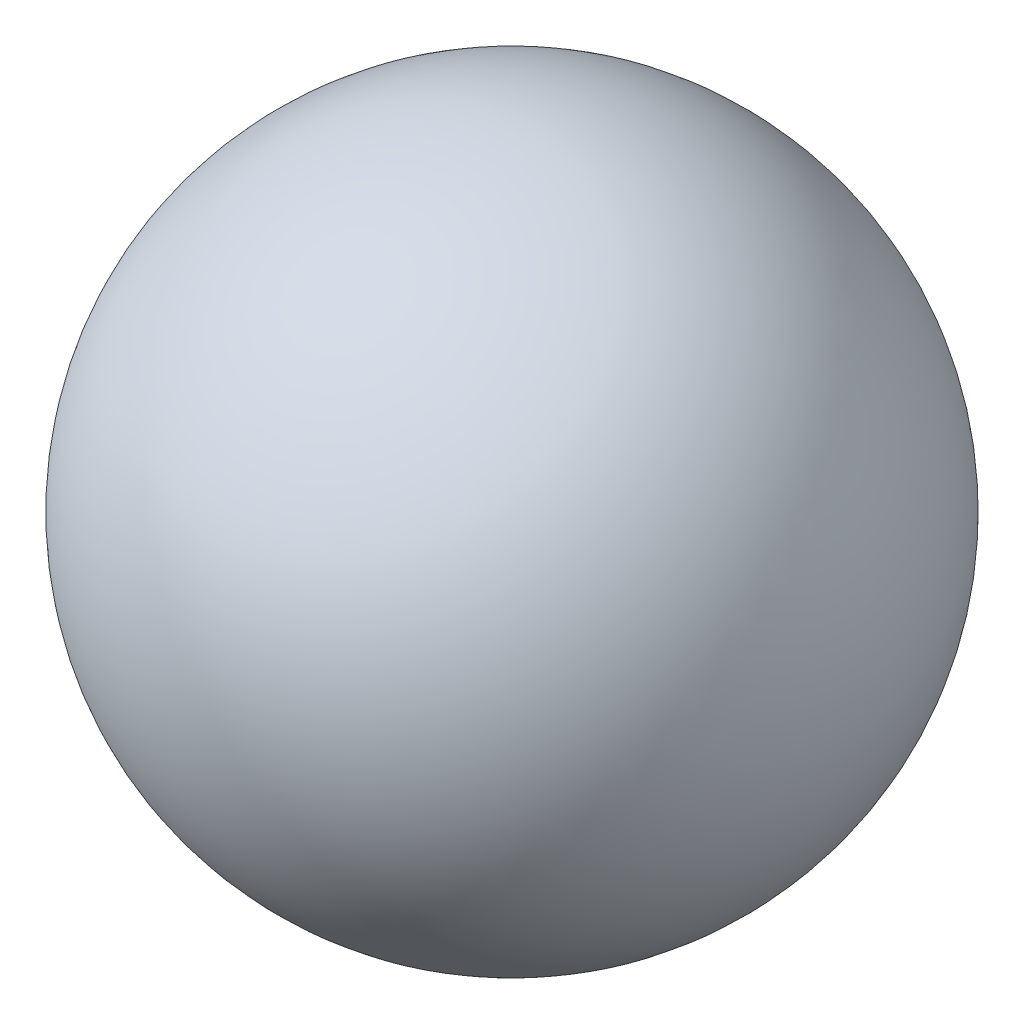
ISO-10303-21;
HEADER;
FILE_DESCRIPTION(('STEP AP214'),'2;1');
FILE_NAME('part.step','',(''),(''),'','','');
FILE_SCHEMA(('AUTOMOTIVE_DESIGN { 1 0 10303 214 1 1 1 1 }'));
ENDSEC;
DATA;
#1=APPLICATION_CONTEXT('core data for automotive mechanical design processes');
#2=APPLICATION_PROTOCOL_DEFINITION('international standard','automotive_design',2000,#1);
#3=PRODUCT_CONTEXT('',#1,'mechanical');
#4=PRODUCT('Part','Part','',(#3));
#5=PRODUCT_RELATED_PRODUCT_CATEGORY('part','',(#4));
#6=PRODUCT_DEFINITION_FORMATION('','',#4);
#7=PRODUCT_DEFINITION_CONTEXT('part definition',#1,'design');
#8=PRODUCT_DEFINITION('design','',#6,#7);
#9=PRODUCT_DEFINITION_SHAPE('','',#8);
#10=(LENGTH_UNIT() NAMED_UNIT(*) SI_UNIT(.MILLI.,.METRE.));
#11=(NAMED_UNIT(*) PLANE_ANGLE_UNIT() SI_UNIT($,.RADIAN.));
#12=(NAMED_UNIT(*) SI_UNIT($,.STERADIAN.) SOLID_ANGLE_UNIT());
#13=UNCERTAINTY_MEASURE_WITH_UNIT(LENGTH_MEASURE(1.E-05),#10,'distance_accuracy_value','');
#14=(GEOMETRIC_REPRESENTATION_CONTEXT(3) GLOBAL_UNCERTAINTY_ASSIGNED_CONTEXT((#13)) GLOBAL_UNIT_ASSIGNED_CONTEXT((#10,
#11,#12)) REPRESENTATION_CONTEXT('',''));
#15=CARTESIAN_POINT('',(0.,0.,0.));
#16=DIRECTION('',(0.,0.,1.));
#17=DIRECTION('',(1.,0.,0.));
#18=AXIS2_PLACEMENT_3D('',#15,#16,#17);
#19=CARTESIAN_POINT('',(0.,0.,0.));
#20=DIRECTION('',(0.,1.,0.));
#21=DIRECTION('',(0.,0.,-1.));
#22=AXIS2_PLACEMENT_3D('',#19,#20,#21);
#23=SPHERICAL_SURFACE('',#22,88.9);
#24=CARTESIAN_POINT('',(0.,88.9,0.));
#25=VERTEX_POINT('',#24);
#26=VERTEX_LOOP('',#25);
#27=FACE_BOUND('',#26,.T.);
#28=ADVANCED_FACE('F30',(#27),#23,.T.);
#29=CLOSED_SHELL('',(#28));
#30=MANIFOLD_SOLID_BREP('B2',#29);
#31=ADVANCED_BREP_SHAPE_REPRESENTATION('',(#18,#30),#14);
#32=SHAPE_DEFINITION_REPRESENTATION(#9,#31);
ENDSEC;
END-ISO-10303-21;
